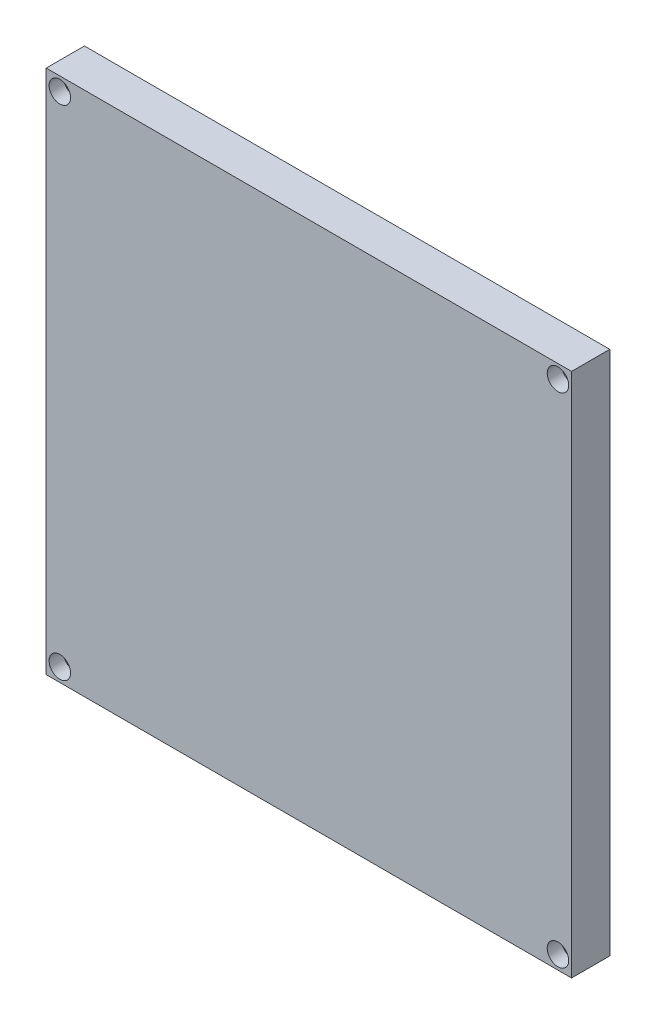
ISO-10303-21;
HEADER;
FILE_DESCRIPTION(('STEP AP214'),'2;1');
FILE_NAME('part.step','',(''),(''),'','','');
FILE_SCHEMA(('AUTOMOTIVE_DESIGN { 1 0 10303 214 1 1 1 1 }'));
ENDSEC;
DATA;
#1=APPLICATION_CONTEXT('core data for automotive mechanical design processes');
#2=APPLICATION_PROTOCOL_DEFINITION('international standard','automotive_design',2000,#1);
#3=PRODUCT_CONTEXT('',#1,'mechanical');
#4=PRODUCT('Part','Part','',(#3));
#5=PRODUCT_RELATED_PRODUCT_CATEGORY('part','',(#4));
#6=PRODUCT_DEFINITION_FORMATION('','',#4);
#7=PRODUCT_DEFINITION_CONTEXT('part definition',#1,'design');
#8=PRODUCT_DEFINITION('design','',#6,#7);
#9=PRODUCT_DEFINITION_SHAPE('','',#8);
#10=(LENGTH_UNIT() NAMED_UNIT(*) SI_UNIT(.MILLI.,.METRE.));
#11=(NAMED_UNIT(*) PLANE_ANGLE_UNIT() SI_UNIT($,.RADIAN.));
#12=(NAMED_UNIT(*) SI_UNIT($,.STERADIAN.) SOLID_ANGLE_UNIT());
#13=UNCERTAINTY_MEASURE_WITH_UNIT(LENGTH_MEASURE(1.E-05),#10,'distance_accuracy_value','');
#14=(GEOMETRIC_REPRESENTATION_CONTEXT(3) GLOBAL_UNCERTAINTY_ASSIGNED_CONTEXT((#13)) GLOBAL_UNIT_ASSIGNED_CONTEXT((#10,
#11,#12)) REPRESENTATION_CONTEXT('',''));
#15=CARTESIAN_POINT('',(0.,0.,0.));
#16=DIRECTION('',(0.,0.,1.));
#17=DIRECTION('',(1.,0.,0.));
#18=AXIS2_PLACEMENT_3D('',#15,#16,#17);
#19=CARTESIAN_POINT('',(-52.1491251125079,52.1491251125079,-0.000999999999999265));
#20=DIRECTION('',(0.,0.,1.));
#21=DIRECTION('',(1.,0.,0.));
#22=AXIS2_PLACEMENT_3D('',#19,#20,#21);
#23=CYLINDRICAL_SURFACE('',#22,1.575);
#24=CARTESIAN_POINT('',(-52.1491251125079,52.1491251125079,0.));
#25=DIRECTION('',(0.,0.,1.));
#26=DIRECTION('',(1.,0.,0.));
#27=AXIS2_PLACEMENT_3D('',#24,#25,#26);
#28=CIRCLE('',#27,1.575);
#29=CARTESIAN_POINT('',(-50.5741251125079,52.1491251125079,0.));
#30=VERTEX_POINT('',#29);
#31=EDGE_CURVE('E109',#30,#30,#28,.F.);
#32=ORIENTED_EDGE('',*,*,#31,.T.);
#33=EDGE_LOOP('',(#32));
#34=FACE_BOUND('',#33,.T.);
#35=CARTESIAN_POINT('',(-52.1491251125079,52.1491251125079,5.));
#36=DIRECTION('',(0.,0.,1.));
#37=DIRECTION('',(1.,0.,0.));
#38=AXIS2_PLACEMENT_3D('',#35,#36,#37);
#39=CIRCLE('',#38,1.575);
#40=CARTESIAN_POINT('',(-50.5741251125079,52.1491251125079,5.));
#41=VERTEX_POINT('',#40);
#42=EDGE_CURVE('E43',#41,#41,#39,.F.);
#43=ORIENTED_EDGE('',*,*,#42,.F.);
#44=EDGE_LOOP('',(#43));
#45=FACE_BOUND('',#44,.T.);
#46=ADVANCED_FACE('F39',(#34,#45),#23,.F.);
#47=CARTESIAN_POINT('',(52.1491251125079,-52.1491251125079,-0.000999999999999265));
#48=DIRECTION('',(0.,0.,1.));
#49=DIRECTION('',(1.,0.,0.));
#50=AXIS2_PLACEMENT_3D('',#47,#48,#49);
#51=CYLINDRICAL_SURFACE('',#50,1.575);
#52=CARTESIAN_POINT('',(52.1491251125079,-52.1491251125079,0.));
#53=DIRECTION('',(0.,0.,1.));
#54=DIRECTION('',(1.,0.,0.));
#55=AXIS2_PLACEMENT_3D('',#52,#53,#54);
#56=CIRCLE('',#55,1.575);
#57=CARTESIAN_POINT('',(53.7241251125079,-52.1491251125079,0.));
#58=VERTEX_POINT('',#57);
#59=EDGE_CURVE('E130',#58,#58,#56,.F.);
#60=ORIENTED_EDGE('',*,*,#59,.T.);
#61=EDGE_LOOP('',(#60));
#62=FACE_BOUND('',#61,.T.);
#63=CARTESIAN_POINT('',(52.1491251125079,-52.1491251125079,5.));
#64=DIRECTION('',(0.,0.,1.));
#65=DIRECTION('',(1.,0.,0.));
#66=AXIS2_PLACEMENT_3D('',#63,#64,#65);
#67=CIRCLE('',#66,1.575);
#68=CARTESIAN_POINT('',(53.7241251125079,-52.1491251125079,5.));
#69=VERTEX_POINT('',#68);
#70=EDGE_CURVE('E118',#69,#69,#67,.F.);
#71=ORIENTED_EDGE('',*,*,#70,.F.);
#72=EDGE_LOOP('',(#71));
#73=FACE_BOUND('',#72,.T.);
#74=ADVANCED_FACE('F200',(#62,#73),#51,.F.);
#75=CARTESIAN_POINT('',(-55.,-55.,8.));
#76=DIRECTION('',(1.,0.,0.));
#77=DIRECTION('',(0.,0.,-1.));
#78=AXIS2_PLACEMENT_3D('',#75,#76,#77);
#79=PLANE('',#78);
#80=DIRECTION('',(0.,-1.,0.));
#81=VECTOR('',#80,1.);
#82=CARTESIAN_POINT('',(-55.,-55.,0.));
#83=LINE('',#82,#81);
#84=CARTESIAN_POINT('',(-55.,55.,0.));
#85=VERTEX_POINT('',#84);
#86=CARTESIAN_POINT('',(-55.,-55.,0.));
#87=VERTEX_POINT('',#86);
#88=EDGE_CURVE('E106',#85,#87,#83,.T.);
#89=ORIENTED_EDGE('',*,*,#88,.T.);
#90=DIRECTION('',(0.,0.,-1.));
#91=VECTOR('',#90,1.);
#92=CARTESIAN_POINT('',(-55.,-55.,8.));
#93=LINE('',#92,#91);
#94=CARTESIAN_POINT('',(-55.,-55.,8.));
#95=VERTEX_POINT('',#94);
#96=EDGE_CURVE('E11',#95,#87,#93,.T.);
#97=ORIENTED_EDGE('',*,*,#96,.F.);
#98=DIRECTION('',(0.,-1.,0.));
#99=VECTOR('',#98,1.);
#100=CARTESIAN_POINT('',(-55.,-55.,8.));
#101=LINE('',#100,#99);
#102=CARTESIAN_POINT('',(-55.,55.,8.));
#103=VERTEX_POINT('',#102);
#104=EDGE_CURVE('E93',#103,#95,#101,.T.);
#105=ORIENTED_EDGE('',*,*,#104,.F.);
#106=DIRECTION('',(0.,0.,-1.));
#107=VECTOR('',#106,1.);
#108=CARTESIAN_POINT('',(-55.,55.,8.));
#109=LINE('',#108,#107);
#110=EDGE_CURVE('E102',#103,#85,#109,.T.);
#111=ORIENTED_EDGE('',*,*,#110,.T.);
#112=EDGE_LOOP('',(#89,#97,#105,#111));
#113=FACE_BOUND('',#112,.T.);
#114=ADVANCED_FACE('F41',(#113),#79,.F.);
#115=CARTESIAN_POINT('',(55.,-55.,8.));
#116=DIRECTION('',(0.,1.,0.));
#117=DIRECTION('',(-1.,0.,0.));
#118=AXIS2_PLACEMENT_3D('',#115,#116,#117);
#119=PLANE('',#118);
#120=DIRECTION('',(1.,0.,0.));
#121=VECTOR('',#120,1.);
#122=CARTESIAN_POINT('',(55.,-55.,0.));
#123=LINE('',#122,#121);
#124=CARTESIAN_POINT('',(55.,-55.,0.));
#125=VERTEX_POINT('',#124);
#126=EDGE_CURVE('E97',#87,#125,#123,.T.);
#127=ORIENTED_EDGE('',*,*,#126,.T.);
#128=DIRECTION('',(0.,0.,-1.));
#129=VECTOR('',#128,1.);
#130=CARTESIAN_POINT('',(55.,-55.,8.));
#131=LINE('',#130,#129);
#132=CARTESIAN_POINT('',(55.,-55.,8.));
#133=VERTEX_POINT('',#132);
#134=EDGE_CURVE('E49',#133,#125,#131,.T.);
#135=ORIENTED_EDGE('',*,*,#134,.F.);
#136=DIRECTION('',(1.,0.,0.));
#137=VECTOR('',#136,1.);
#138=CARTESIAN_POINT('',(55.,-55.,8.));
#139=LINE('',#138,#137);
#140=EDGE_CURVE('E88',#95,#133,#139,.T.);
#141=ORIENTED_EDGE('',*,*,#140,.F.);
#142=ORIENTED_EDGE('',*,*,#96,.T.);
#143=EDGE_LOOP('',(#127,#135,#141,#142));
#144=FACE_BOUND('',#143,.T.);
#145=ADVANCED_FACE('F96',(#144),#119,.F.);
#146=CARTESIAN_POINT('',(55.,-55.,8.));
#147=DIRECTION('',(-1.,0.,0.));
#148=DIRECTION('',(0.,0.,1.));
#149=AXIS2_PLACEMENT_3D('',#146,#147,#148);
#150=PLANE('',#149);
#151=DIRECTION('',(0.,1.,0.));
#152=VECTOR('',#151,1.);
#153=CARTESIAN_POINT('',(55.,-55.,0.));
#154=LINE('',#153,#152);
#155=CARTESIAN_POINT('',(55.,55.,0.));
#156=VERTEX_POINT('',#155);
#157=EDGE_CURVE('E75',#125,#156,#154,.T.);
#158=ORIENTED_EDGE('',*,*,#157,.T.);
#159=DIRECTION('',(0.,0.,-1.));
#160=VECTOR('',#159,1.);
#161=CARTESIAN_POINT('',(55.,55.,8.));
#162=LINE('',#161,#160);
#163=CARTESIAN_POINT('',(55.,55.,8.));
#164=VERTEX_POINT('',#163);
#165=EDGE_CURVE('E98',#164,#156,#162,.T.);
#166=ORIENTED_EDGE('',*,*,#165,.F.);
#167=DIRECTION('',(0.,1.,0.));
#168=VECTOR('',#167,1.);
#169=CARTESIAN_POINT('',(55.,-55.,8.));
#170=LINE('',#169,#168);
#171=EDGE_CURVE('E91',#133,#164,#170,.T.);
#172=ORIENTED_EDGE('',*,*,#171,.F.);
#173=ORIENTED_EDGE('',*,*,#134,.T.);
#174=EDGE_LOOP('',(#158,#166,#172,#173));
#175=FACE_BOUND('',#174,.T.);
#176=ADVANCED_FACE('F100',(#175),#150,.F.);
#177=CARTESIAN_POINT('',(55.,55.,8.));
#178=DIRECTION('',(0.,-1.,0.));
#179=DIRECTION('',(1.,0.,0.));
#180=AXIS2_PLACEMENT_3D('',#177,#178,#179);
#181=PLANE('',#180);
#182=DIRECTION('',(-1.,0.,0.));
#183=VECTOR('',#182,1.);
#184=CARTESIAN_POINT('',(55.,55.,0.));
#185=LINE('',#184,#183);
#186=EDGE_CURVE('E81',#156,#85,#185,.T.);
#187=ORIENTED_EDGE('',*,*,#186,.T.);
#188=ORIENTED_EDGE('',*,*,#110,.F.);
#189=DIRECTION('',(-1.,0.,0.));
#190=VECTOR('',#189,1.);
#191=CARTESIAN_POINT('',(55.,55.,8.));
#192=LINE('',#191,#190);
#193=EDGE_CURVE('E58',#164,#103,#192,.T.);
#194=ORIENTED_EDGE('',*,*,#193,.F.);
#195=ORIENTED_EDGE('',*,*,#165,.T.);
#196=EDGE_LOOP('',(#187,#188,#194,#195));
#197=FACE_BOUND('',#196,.T.);
#198=ADVANCED_FACE('F183',(#197),#181,.F.);
#199=CARTESIAN_POINT('',(0.,0.,8.));
#200=DIRECTION('',(0.,0.,1.));
#201=DIRECTION('',(1.,0.,0.));
#202=AXIS2_PLACEMENT_3D('',#199,#200,#201);
#203=PLANE('',#202);
#204=CARTESIAN_POINT('',(52.1491251125079,52.1491251125079,8.));
#205=DIRECTION('',(0.,0.,1.));
#206=DIRECTION('',(-1.,0.,0.));
#207=AXIS2_PLACEMENT_3D('',#204,#205,#206);
#208=CIRCLE('',#207,2.25);
#209=CARTESIAN_POINT('',(49.8991251125079,52.1491251125079,8.));
#210=VERTEX_POINT('',#209);
#211=EDGE_CURVE('E152',#210,#210,#208,.T.);
#212=ORIENTED_EDGE('',*,*,#211,.F.);
#213=EDGE_LOOP('',(#212));
#214=FACE_BOUND('',#213,.T.);
#215=CARTESIAN_POINT('',(52.1491251125079,-52.1491251125079,8.));
#216=DIRECTION('',(0.,0.,1.));
#217=DIRECTION('',(1.,0.,0.));
#218=AXIS2_PLACEMENT_3D('',#215,#216,#217);
#219=CIRCLE('',#218,2.25);
#220=CARTESIAN_POINT('',(54.3991251125079,-52.1491251125079,8.));
#221=VERTEX_POINT('',#220);
#222=EDGE_CURVE('E158',#221,#221,#219,.T.);
#223=ORIENTED_EDGE('',*,*,#222,.F.);
#224=EDGE_LOOP('',(#223));
#225=FACE_BOUND('',#224,.T.);
#226=CARTESIAN_POINT('',(-52.1491251125079,-52.1491251125079,8.));
#227=DIRECTION('',(0.,0.,1.));
#228=DIRECTION('',(-1.,0.,0.));
#229=AXIS2_PLACEMENT_3D('',#226,#227,#228);
#230=CIRCLE('',#229,2.25);
#231=CARTESIAN_POINT('',(-54.3991251125079,-52.1491251125079,8.));
#232=VERTEX_POINT('',#231);
#233=EDGE_CURVE('E164',#232,#232,#230,.T.);
#234=ORIENTED_EDGE('',*,*,#233,.F.);
#235=EDGE_LOOP('',(#234));
#236=FACE_BOUND('',#235,.T.);
#237=CARTESIAN_POINT('',(-52.1491251125079,52.1491251125079,8.));
#238=DIRECTION('',(0.,0.,1.));
#239=DIRECTION('',(1.,0.,0.));
#240=AXIS2_PLACEMENT_3D('',#237,#238,#239);
#241=CIRCLE('',#240,2.25);
#242=CARTESIAN_POINT('',(-49.8991251125079,52.1491251125079,8.));
#243=VERTEX_POINT('',#242);
#244=EDGE_CURVE('E146',#243,#243,#241,.T.);
#245=ORIENTED_EDGE('',*,*,#244,.F.);
#246=EDGE_LOOP('',(#245));
#247=FACE_BOUND('',#246,.T.);
#248=ORIENTED_EDGE('',*,*,#104,.T.);
#249=ORIENTED_EDGE('',*,*,#140,.T.);
#250=ORIENTED_EDGE('',*,*,#171,.T.);
#251=ORIENTED_EDGE('',*,*,#193,.T.);
#252=EDGE_LOOP('',(#248,#249,#250,#251));
#253=FACE_BOUND('',#252,.T.);
#254=ADVANCED_FACE('F89',(#214,#225,#236,#247,#253),#203,.T.);
#255=CARTESIAN_POINT('',(0.,0.,0.));
#256=DIRECTION('',(0.,0.,1.));
#257=DIRECTION('',(1.,0.,0.));
#258=AXIS2_PLACEMENT_3D('',#255,#256,#257);
#259=PLANE('',#258);
#260=CARTESIAN_POINT('',(52.1491251125079,52.1491251125079,0.));
#261=DIRECTION('',(0.,0.,1.));
#262=DIRECTION('',(1.,0.,0.));
#263=AXIS2_PLACEMENT_3D('',#260,#261,#262);
#264=CIRCLE('',#263,1.575);
#265=CARTESIAN_POINT('',(53.7241251125079,52.1491251125079,0.));
#266=VERTEX_POINT('',#265);
#267=EDGE_CURVE('E126',#266,#266,#264,.F.);
#268=ORIENTED_EDGE('',*,*,#267,.F.);
#269=EDGE_LOOP('',(#268));
#270=FACE_BOUND('',#269,.T.);
#271=ORIENTED_EDGE('',*,*,#59,.F.);
#272=EDGE_LOOP('',(#271));
#273=FACE_BOUND('',#272,.T.);
#274=CARTESIAN_POINT('',(-52.1491251125079,-52.1491251125079,0.));
#275=DIRECTION('',(0.,0.,1.));
#276=DIRECTION('',(1.,0.,0.));
#277=AXIS2_PLACEMENT_3D('',#274,#275,#276);
#278=CIRCLE('',#277,1.575);
#279=CARTESIAN_POINT('',(-50.5741251125079,-52.1491251125079,0.));
#280=VERTEX_POINT('',#279);
#281=EDGE_CURVE('E135',#280,#280,#278,.F.);
#282=ORIENTED_EDGE('',*,*,#281,.F.);
#283=EDGE_LOOP('',(#282));
#284=FACE_BOUND('',#283,.T.);
#285=ORIENTED_EDGE('',*,*,#31,.F.);
#286=EDGE_LOOP('',(#285));
#287=FACE_BOUND('',#286,.T.);
#288=ORIENTED_EDGE('',*,*,#88,.F.);
#289=ORIENTED_EDGE('',*,*,#186,.F.);
#290=ORIENTED_EDGE('',*,*,#157,.F.);
#291=ORIENTED_EDGE('',*,*,#126,.F.);
#292=EDGE_LOOP('',(#288,#289,#290,#291));
#293=FACE_BOUND('',#292,.T.);
#294=ADVANCED_FACE('F182',(#270,#273,#284,#287,#293),#259,.F.);
#295=CARTESIAN_POINT('',(-52.1491251125079,-52.1491251125079,-0.000999999999999265));
#296=DIRECTION('',(0.,0.,1.));
#297=DIRECTION('',(1.,0.,0.));
#298=AXIS2_PLACEMENT_3D('',#295,#296,#297);
#299=CYLINDRICAL_SURFACE('',#298,1.575);
#300=CARTESIAN_POINT('',(-52.1491251125079,-52.1491251125079,5.));
#301=DIRECTION('',(0.,0.,-1.));
#302=DIRECTION('',(-1.,0.,0.));
#303=AXIS2_PLACEMENT_3D('',#300,#301,#302);
#304=CIRCLE('',#303,1.575);
#305=CARTESIAN_POINT('',(-53.7241251125079,-52.1491251125079,5.));
#306=VERTEX_POINT('',#305);
#307=EDGE_CURVE('E121',#306,#306,#304,.F.);
#308=ORIENTED_EDGE('',*,*,#307,.T.);
#309=EDGE_LOOP('',(#308));
#310=FACE_BOUND('',#309,.T.);
#311=ORIENTED_EDGE('',*,*,#281,.T.);
#312=EDGE_LOOP('',(#311));
#313=FACE_BOUND('',#312,.T.);
#314=ADVANCED_FACE('F213',(#310,#313),#299,.F.);
#315=CARTESIAN_POINT('',(52.1491251125079,52.1491251125079,-0.000999999999999265));
#316=DIRECTION('',(0.,0.,1.));
#317=DIRECTION('',(1.,0.,0.));
#318=AXIS2_PLACEMENT_3D('',#315,#316,#317);
#319=CYLINDRICAL_SURFACE('',#318,1.575);
#320=CARTESIAN_POINT('',(52.1491251125079,52.1491251125079,5.));
#321=DIRECTION('',(0.,0.,-1.));
#322=DIRECTION('',(-1.,0.,0.));
#323=AXIS2_PLACEMENT_3D('',#320,#321,#322);
#324=CIRCLE('',#323,1.575);
#325=CARTESIAN_POINT('',(50.5741251125079,52.1491251125079,5.));
#326=VERTEX_POINT('',#325);
#327=EDGE_CURVE('E115',#326,#326,#324,.F.);
#328=ORIENTED_EDGE('',*,*,#327,.T.);
#329=EDGE_LOOP('',(#328));
#330=FACE_BOUND('',#329,.T.);
#331=ORIENTED_EDGE('',*,*,#267,.T.);
#332=EDGE_LOOP('',(#331));
#333=FACE_BOUND('',#332,.T.);
#334=ADVANCED_FACE('F209',(#330,#333),#319,.F.);
#335=CARTESIAN_POINT('',(52.1491251125079,52.1491251125079,5.));
#336=DIRECTION('',(0.,0.,-1.));
#337=DIRECTION('',(-1.,0.,0.));
#338=AXIS2_PLACEMENT_3D('',#335,#336,#337);
#339=PLANE('',#338);
#340=CARTESIAN_POINT('',(52.1491251125079,52.1491251125079,5.));
#341=DIRECTION('',(0.,0.,1.));
#342=DIRECTION('',(-1.,0.,0.));
#343=AXIS2_PLACEMENT_3D('',#340,#341,#342);
#344=CIRCLE('',#343,2.25);
#345=CARTESIAN_POINT('',(49.8991251125079,52.1491251125079,5.));
#346=VERTEX_POINT('',#345);
#347=EDGE_CURVE('E155',#346,#346,#344,.T.);
#348=ORIENTED_EDGE('',*,*,#347,.T.);
#349=EDGE_LOOP('',(#348));
#350=FACE_BOUND('',#349,.T.);
#351=ORIENTED_EDGE('',*,*,#327,.F.);
#352=EDGE_LOOP('',(#351));
#353=FACE_BOUND('',#352,.T.);
#354=ADVANCED_FACE('F258',(#350,#353),#339,.F.);
#355=CARTESIAN_POINT('',(52.1491251125079,52.1491251125079,5.));
#356=DIRECTION('',(0.,0.,1.));
#357=DIRECTION('',(1.,0.,0.));
#358=AXIS2_PLACEMENT_3D('',#355,#356,#357);
#359=CYLINDRICAL_SURFACE('',#358,2.25);
#360=ORIENTED_EDGE('',*,*,#347,.F.);
#361=EDGE_LOOP('',(#360));
#362=FACE_BOUND('',#361,.T.);
#363=ORIENTED_EDGE('',*,*,#211,.T.);
#364=EDGE_LOOP('',(#363));
#365=FACE_BOUND('',#364,.T.);
#366=ADVANCED_FACE('F267',(#362,#365),#359,.F.);
#367=CARTESIAN_POINT('',(52.1491251125079,-52.1491251125079,5.));
#368=DIRECTION('',(0.,0.,1.));
#369=DIRECTION('',(1.,0.,0.));
#370=AXIS2_PLACEMENT_3D('',#367,#368,#369);
#371=PLANE('',#370);
#372=CARTESIAN_POINT('',(52.1491251125079,-52.1491251125079,5.));
#373=DIRECTION('',(0.,0.,1.));
#374=DIRECTION('',(1.,0.,0.));
#375=AXIS2_PLACEMENT_3D('',#372,#373,#374);
#376=CIRCLE('',#375,2.25);
#377=CARTESIAN_POINT('',(54.3991251125079,-52.1491251125079,5.));
#378=VERTEX_POINT('',#377);
#379=EDGE_CURVE('E161',#378,#378,#376,.T.);
#380=ORIENTED_EDGE('',*,*,#379,.T.);
#381=EDGE_LOOP('',(#380));
#382=FACE_BOUND('',#381,.T.);
#383=ORIENTED_EDGE('',*,*,#70,.T.);
#384=EDGE_LOOP('',(#383));
#385=FACE_BOUND('',#384,.T.);
#386=ADVANCED_FACE('F277',(#382,#385),#371,.T.);
#387=CARTESIAN_POINT('',(52.1491251125079,-52.1491251125079,5.));
#388=DIRECTION('',(0.,0.,1.));
#389=DIRECTION('',(1.,0.,0.));
#390=AXIS2_PLACEMENT_3D('',#387,#388,#389);
#391=CYLINDRICAL_SURFACE('',#390,2.25);
#392=ORIENTED_EDGE('',*,*,#379,.F.);
#393=EDGE_LOOP('',(#392));
#394=FACE_BOUND('',#393,.T.);
#395=ORIENTED_EDGE('',*,*,#222,.T.);
#396=EDGE_LOOP('',(#395));
#397=FACE_BOUND('',#396,.T.);
#398=ADVANCED_FACE('F287',(#394,#397),#391,.F.);
#399=CARTESIAN_POINT('',(-52.1491251125079,-52.1491251125079,5.));
#400=DIRECTION('',(0.,0.,-1.));
#401=DIRECTION('',(-1.,0.,0.));
#402=AXIS2_PLACEMENT_3D('',#399,#400,#401);
#403=PLANE('',#402);
#404=CARTESIAN_POINT('',(-52.1491251125079,-52.1491251125079,5.));
#405=DIRECTION('',(0.,0.,1.));
#406=DIRECTION('',(-1.,0.,0.));
#407=AXIS2_PLACEMENT_3D('',#404,#405,#406);
#408=CIRCLE('',#407,2.25);
#409=CARTESIAN_POINT('',(-54.3991251125079,-52.1491251125079,5.));
#410=VERTEX_POINT('',#409);
#411=EDGE_CURVE('E149',#410,#410,#408,.T.);
#412=ORIENTED_EDGE('',*,*,#411,.T.);
#413=EDGE_LOOP('',(#412));
#414=FACE_BOUND('',#413,.T.);
#415=ORIENTED_EDGE('',*,*,#307,.F.);
#416=EDGE_LOOP('',(#415));
#417=FACE_BOUND('',#416,.T.);
#418=ADVANCED_FACE('F170',(#414,#417),#403,.F.);
#419=CARTESIAN_POINT('',(-52.1491251125079,-52.1491251125079,5.));
#420=DIRECTION('',(0.,0.,1.));
#421=DIRECTION('',(1.,0.,0.));
#422=AXIS2_PLACEMENT_3D('',#419,#420,#421);
#423=CYLINDRICAL_SURFACE('',#422,2.25);
#424=ORIENTED_EDGE('',*,*,#411,.F.);
#425=EDGE_LOOP('',(#424));
#426=FACE_BOUND('',#425,.T.);
#427=ORIENTED_EDGE('',*,*,#233,.T.);
#428=EDGE_LOOP('',(#427));
#429=FACE_BOUND('',#428,.T.);
#430=ADVANCED_FACE('F173',(#426,#429),#423,.F.);
#431=CARTESIAN_POINT('',(-52.1491251125079,52.1491251125079,5.));
#432=DIRECTION('',(0.,0.,1.));
#433=DIRECTION('',(1.,0.,0.));
#434=AXIS2_PLACEMENT_3D('',#431,#432,#433);
#435=PLANE('',#434);
#436=CARTESIAN_POINT('',(-52.1491251125079,52.1491251125079,5.));
#437=DIRECTION('',(0.,0.,1.));
#438=DIRECTION('',(1.,0.,0.));
#439=AXIS2_PLACEMENT_3D('',#436,#437,#438);
#440=CIRCLE('',#439,2.25);
#441=CARTESIAN_POINT('',(-49.8991251125079,52.1491251125079,5.));
#442=VERTEX_POINT('',#441);
#443=EDGE_CURVE('E119',#442,#442,#440,.T.);
#444=ORIENTED_EDGE('',*,*,#443,.T.);
#445=EDGE_LOOP('',(#444));
#446=FACE_BOUND('',#445,.T.);
#447=ORIENTED_EDGE('',*,*,#42,.T.);
#448=EDGE_LOOP('',(#447));
#449=FACE_BOUND('',#448,.T.);
#450=ADVANCED_FACE('F176',(#446,#449),#435,.T.);
#451=CARTESIAN_POINT('',(-52.1491251125079,52.1491251125079,5.));
#452=DIRECTION('',(0.,0.,1.));
#453=DIRECTION('',(1.,0.,0.));
#454=AXIS2_PLACEMENT_3D('',#451,#452,#453);
#455=CYLINDRICAL_SURFACE('',#454,2.25);
#456=ORIENTED_EDGE('',*,*,#443,.F.);
#457=EDGE_LOOP('',(#456));
#458=FACE_BOUND('',#457,.T.);
#459=ORIENTED_EDGE('',*,*,#244,.T.);
#460=EDGE_LOOP('',(#459));
#461=FACE_BOUND('',#460,.T.);
#462=ADVANCED_FACE('F188',(#458,#461),#455,.F.);
#463=CLOSED_SHELL('',(#46,#74,#114,#145,#176,#198,#254,#294,#314,#334,#354,#366,#386,#398,#418,
#430,#450,#462));
#464=MANIFOLD_SOLID_BREP('B2',#463);
#465=ADVANCED_BREP_SHAPE_REPRESENTATION('',(#18,#464),#14);
#466=SHAPE_DEFINITION_REPRESENTATION(#9,#465);
ENDSEC;
END-ISO-10303-21;
